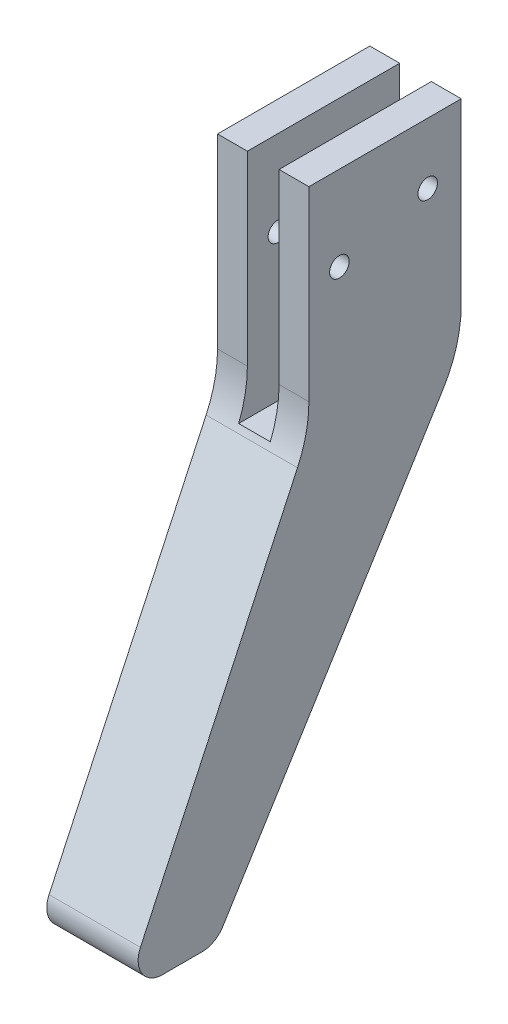
ISO-10303-21;
HEADER;
FILE_DESCRIPTION(('STEP AP214'),'2;1');
FILE_NAME('part.step','',(''),(''),'','','');
FILE_SCHEMA(('AUTOMOTIVE_DESIGN { 1 0 10303 214 1 1 1 1 }'));
ENDSEC;
DATA;
#1=APPLICATION_CONTEXT('core data for automotive mechanical design processes');
#2=APPLICATION_PROTOCOL_DEFINITION('international standard','automotive_design',2000,#1);
#3=PRODUCT_CONTEXT('',#1,'mechanical');
#4=PRODUCT('Part','Part','',(#3));
#5=PRODUCT_RELATED_PRODUCT_CATEGORY('part','',(#4));
#6=PRODUCT_DEFINITION_FORMATION('','',#4);
#7=PRODUCT_DEFINITION_CONTEXT('part definition',#1,'design');
#8=PRODUCT_DEFINITION('design','',#6,#7);
#9=PRODUCT_DEFINITION_SHAPE('','',#8);
#10=(LENGTH_UNIT() NAMED_UNIT(*) SI_UNIT(.MILLI.,.METRE.));
#11=(NAMED_UNIT(*) PLANE_ANGLE_UNIT() SI_UNIT($,.RADIAN.));
#12=(NAMED_UNIT(*) SI_UNIT($,.STERADIAN.) SOLID_ANGLE_UNIT());
#13=UNCERTAINTY_MEASURE_WITH_UNIT(LENGTH_MEASURE(1.E-05),#10,'distance_accuracy_value','');
#14=(GEOMETRIC_REPRESENTATION_CONTEXT(3) GLOBAL_UNCERTAINTY_ASSIGNED_CONTEXT((#13)) GLOBAL_UNIT_ASSIGNED_CONTEXT((#10,
#11,#12)) REPRESENTATION_CONTEXT('',''));
#15=CARTESIAN_POINT('',(0.,0.,0.));
#16=DIRECTION('',(0.,0.,1.));
#17=DIRECTION('',(1.,0.,0.));
#18=AXIS2_PLACEMENT_3D('',#15,#16,#17);
#19=CARTESIAN_POINT('',(7.5,-13.4117647058824,9.80392156862744));
#20=DIRECTION('',(0.,0.,-1.));
#21=DIRECTION('',(0.,1.,0.));
#22=AXIS2_PLACEMENT_3D('',#19,#20,#21);
#23=PLANE('',#22);
#24=DIRECTION('',(-1.,0.,0.));
#25=VECTOR('',#24,1.);
#26=CARTESIAN_POINT('',(7.5,-8.97787145302357,9.80392156862744));
#27=LINE('',#26,#25);
#28=CARTESIAN_POINT('',(-7.5,-8.97787145302357,9.80392156862744));
#29=VERTEX_POINT('',#28);
#30=CARTESIAN_POINT('',(-2.6,-8.97787145302357,9.80392156862744));
#31=VERTEX_POINT('',#30);
#32=EDGE_CURVE('E232',#29,#31,#27,.F.);
#33=ORIENTED_EDGE('',*,*,#32,.T.);
#34=DIRECTION('',(0.,1.,0.));
#35=VECTOR('',#34,1.);
#36=CARTESIAN_POINT('',(-2.6,-13.4117647058824,9.80392156862744));
#37=LINE('',#36,#35);
#38=CARTESIAN_POINT('',(-2.6,21.5882352941176,9.80392156862744));
#39=VERTEX_POINT('',#38);
#40=EDGE_CURVE('E170',#31,#39,#37,.T.);
#41=ORIENTED_EDGE('',*,*,#40,.T.);
#42=DIRECTION('',(-1.,0.,0.));
#43=VECTOR('',#42,1.);
#44=CARTESIAN_POINT('',(7.5,21.5882352941176,9.80392156862744));
#45=LINE('',#44,#43);
#46=CARTESIAN_POINT('',(-7.5,21.5882352941176,9.80392156862744));
#47=VERTEX_POINT('',#46);
#48=EDGE_CURVE('E194',#39,#47,#45,.T.);
#49=ORIENTED_EDGE('',*,*,#48,.T.);
#50=DIRECTION('',(0.,-1.,0.));
#51=VECTOR('',#50,1.);
#52=CARTESIAN_POINT('',(-7.5,-13.4117647058824,9.80392156862744));
#53=LINE('',#52,#51);
#54=EDGE_CURVE('E172',#47,#29,#53,.T.);
#55=ORIENTED_EDGE('',*,*,#54,.T.);
#56=EDGE_LOOP('',(#33,#41,#49,#55));
#57=FACE_BOUND('',#56,.T.);
#58=ADVANCED_FACE('F34',(#57),#23,.F.);
#59=CARTESIAN_POINT('',(7.5,21.5882352941176,-15.1960784313726));
#60=DIRECTION('',(0.,0.,1.));
#61=DIRECTION('',(0.,-1.,0.));
#62=AXIS2_PLACEMENT_3D('',#59,#60,#61);
#63=PLANE('',#62);
#64=DIRECTION('',(-1.,0.,0.));
#65=VECTOR('',#64,1.);
#66=CARTESIAN_POINT('',(7.5,21.5882352941176,-15.1960784313726));
#67=LINE('',#66,#65);
#68=CARTESIAN_POINT('',(-2.6,21.5882352941176,-15.1960784313726));
#69=VERTEX_POINT('',#68);
#70=CARTESIAN_POINT('',(-7.5,21.5882352941176,-15.1960784313726));
#71=VERTEX_POINT('',#70);
#72=EDGE_CURVE('E213',#69,#71,#67,.T.);
#73=ORIENTED_EDGE('',*,*,#72,.F.);
#74=DIRECTION('',(0.,-1.,0.));
#75=VECTOR('',#74,1.);
#76=CARTESIAN_POINT('',(-2.6,21.5882352941176,-15.1960784313726));
#77=LINE('',#76,#75);
#78=CARTESIAN_POINT('',(-2.6,-7.71361886225819,-15.1960784313726));
#79=VERTEX_POINT('',#78);
#80=EDGE_CURVE('E169',#69,#79,#77,.T.);
#81=ORIENTED_EDGE('',*,*,#80,.T.);
#82=DIRECTION('',(-1.,0.,0.));
#83=VECTOR('',#82,1.);
#84=CARTESIAN_POINT('',(7.5,-7.71361886225819,-15.1960784313726));
#85=LINE('',#84,#83);
#86=CARTESIAN_POINT('',(-7.5,-7.71361886225819,-15.1960784313726));
#87=VERTEX_POINT('',#86);
#88=EDGE_CURVE('E168',#79,#87,#85,.T.);
#89=ORIENTED_EDGE('',*,*,#88,.T.);
#90=DIRECTION('',(0.,1.,0.));
#91=VECTOR('',#90,1.);
#92=CARTESIAN_POINT('',(-7.5,21.5882352941176,-15.1960784313726));
#93=LINE('',#92,#91);
#94=EDGE_CURVE('E205',#87,#71,#93,.T.);
#95=ORIENTED_EDGE('',*,*,#94,.T.);
#96=EDGE_LOOP('',(#73,#81,#89,#95));
#97=FACE_BOUND('',#96,.T.);
#98=ADVANCED_FACE('F326',(#97),#63,.F.);
#99=CARTESIAN_POINT('',(7.5,21.5882352941176,9.80392156862744));
#100=DIRECTION('',(0.,-1.,0.));
#101=DIRECTION('',(0.,0.,-1.));
#102=AXIS2_PLACEMENT_3D('',#99,#100,#101);
#103=PLANE('',#102);
#104=ORIENTED_EDGE('',*,*,#48,.F.);
#105=DIRECTION('',(0.,0.,1.));
#106=VECTOR('',#105,1.);
#107=CARTESIAN_POINT('',(-2.6,21.5882352941176,-19.2260274795571));
#108=LINE('',#107,#106);
#109=EDGE_CURVE('E283',#69,#39,#108,.T.);
#110=ORIENTED_EDGE('',*,*,#109,.F.);
#111=ORIENTED_EDGE('',*,*,#72,.T.);
#112=DIRECTION('',(0.,0.,1.));
#113=VECTOR('',#112,1.);
#114=CARTESIAN_POINT('',(-7.5,21.5882352941176,9.80392156862744));
#115=LINE('',#114,#113);
#116=EDGE_CURVE('E183',#71,#47,#115,.T.);
#117=ORIENTED_EDGE('',*,*,#116,.T.);
#118=EDGE_LOOP('',(#104,#110,#111,#117));
#119=FACE_BOUND('',#118,.T.);
#120=ADVANCED_FACE('F317',(#119),#103,.F.);
#121=CARTESIAN_POINT('',(7.5,21.5882352941176,9.80392156862744));
#122=VERTEX_POINT('',#121);
#123=CARTESIAN_POINT('',(2.6,21.5882352941176,9.80392156862744));
#124=VERTEX_POINT('',#123);
#125=EDGE_CURVE('E210',#122,#124,#45,.T.);
#126=ORIENTED_EDGE('',*,*,#125,.T.);
#127=DIRECTION('',(0.,-1.,0.));
#128=VECTOR('',#127,1.);
#129=CARTESIAN_POINT('',(2.6,-13.4117647058824,9.80392156862744));
#130=LINE('',#129,#128);
#131=CARTESIAN_POINT('',(2.6,-8.97787145302357,9.80392156862744));
#132=VERTEX_POINT('',#131);
#133=EDGE_CURVE('E156',#124,#132,#130,.T.);
#134=ORIENTED_EDGE('',*,*,#133,.T.);
#135=CARTESIAN_POINT('',(7.5,-8.97787145302357,9.80392156862744));
#136=VERTEX_POINT('',#135);
#137=EDGE_CURVE('E231',#132,#136,#27,.F.);
#138=ORIENTED_EDGE('',*,*,#137,.T.);
#139=DIRECTION('',(0.,-1.,0.));
#140=VECTOR('',#139,1.);
#141=CARTESIAN_POINT('',(7.5,-13.4117647058824,9.80392156862744));
#142=LINE('',#141,#140);
#143=EDGE_CURVE('E179',#122,#136,#142,.T.);
#144=ORIENTED_EDGE('',*,*,#143,.F.);
#145=EDGE_LOOP('',(#126,#134,#138,#144));
#146=FACE_BOUND('',#145,.T.);
#147=ADVANCED_FACE('F314',(#146),#23,.F.);
#148=CARTESIAN_POINT('',(7.5,-78.4117647058824,40.1139193487024));
#149=DIRECTION('',(0.,-0.4226182617407,-0.90630778703665));
#150=DIRECTION('',(0.,0.90630778703665,-0.4226182617407));
#151=AXIS2_PLACEMENT_3D('',#148,#149,#150);
#152=PLANE('',#151);
#153=DIRECTION('',(0.,-0.90630778703665,0.4226182617407));
#154=VECTOR('',#153,1.);
#155=CARTESIAN_POINT('',(-7.5,-78.4117647058824,40.1139193487024));
#156=LINE('',#155,#154);
#157=CARTESIAN_POINT('',(-7.5,-17.4302366878376,11.6777658278944));
#158=VERTEX_POINT('',#157);
#159=CARTESIAN_POINT('',(-7.5,-72.7212916589196,37.460408188379));
#160=VERTEX_POINT('',#159);
#161=EDGE_CURVE('E197',#158,#160,#156,.T.);
#162=ORIENTED_EDGE('',*,*,#161,.T.);
#163=DIRECTION('',(-1.,0.,0.));
#164=VECTOR('',#163,1.);
#165=CARTESIAN_POINT('',(7.5,-72.7212916589196,37.460408188379));
#166=LINE('',#165,#164);
#167=CARTESIAN_POINT('',(7.5,-72.7212916589196,37.460408188379));
#168=VERTEX_POINT('',#167);
#169=EDGE_CURVE('E248',#160,#168,#166,.F.);
#170=ORIENTED_EDGE('',*,*,#169,.T.);
#171=DIRECTION('',(0.,-0.90630778703665,0.4226182617407));
#172=VECTOR('',#171,1.);
#173=CARTESIAN_POINT('',(7.5,-78.4117647058824,40.1139193487024));
#174=LINE('',#173,#172);
#175=CARTESIAN_POINT('',(7.5,-17.4302366878376,11.6777658278944));
#176=VERTEX_POINT('',#175);
#177=EDGE_CURVE('E182',#176,#168,#174,.T.);
#178=ORIENTED_EDGE('',*,*,#177,.F.);
#179=DIRECTION('',(-1.,0.,0.));
#180=VECTOR('',#179,1.);
#181=CARTESIAN_POINT('',(-7.5,-17.4302366878376,11.6777658278944));
#182=LINE('',#181,#180);
#183=EDGE_CURVE('E228',#176,#158,#182,.T.);
#184=ORIENTED_EDGE('',*,*,#183,.T.);
#185=EDGE_LOOP('',(#162,#170,#178,#184));
#186=FACE_BOUND('',#185,.T.);
#187=ADVANCED_FACE('F316',(#186),#152,.F.);
#188=CARTESIAN_POINT('',(7.5,-78.4117647058824,25.1139193487024));
#189=DIRECTION('',(0.,1.,0.));
#190=DIRECTION('',(0.,0.,1.));
#191=AXIS2_PLACEMENT_3D('',#188,#189,#190);
#192=PLANE('',#191);
#193=DIRECTION('',(0.,0.,-1.));
#194=VECTOR('',#193,1.);
#195=CARTESIAN_POINT('',(7.5,-78.4117647058824,25.1139193487024));
#196=LINE('',#195,#194);
#197=CARTESIAN_POINT('',(7.5,-78.4117647058824,33.8351770402324));
#198=VERTEX_POINT('',#197);
#199=CARTESIAN_POINT('',(7.5,-78.4117647058824,27.3400494739502));
#200=VERTEX_POINT('',#199);
#201=EDGE_CURVE('E186',#198,#200,#196,.T.);
#202=ORIENTED_EDGE('',*,*,#201,.F.);
#203=DIRECTION('',(-1.,0.,0.));
#204=VECTOR('',#203,1.);
#205=CARTESIAN_POINT('',(7.5,-78.4117647058824,33.8351770402324));
#206=LINE('',#205,#204);
#207=CARTESIAN_POINT('',(-7.5,-78.4117647058824,33.8351770402324));
#208=VERTEX_POINT('',#207);
#209=EDGE_CURVE('E241',#198,#208,#206,.T.);
#210=ORIENTED_EDGE('',*,*,#209,.T.);
#211=DIRECTION('',(0.,0.,-1.));
#212=VECTOR('',#211,1.);
#213=CARTESIAN_POINT('',(-7.5,-78.4117647058824,25.1139193487024));
#214=LINE('',#213,#212);
#215=CARTESIAN_POINT('',(-7.5,-78.4117647058824,27.3400494739502));
#216=VERTEX_POINT('',#215);
#217=EDGE_CURVE('E200',#208,#216,#214,.T.);
#218=ORIENTED_EDGE('',*,*,#217,.T.);
#219=DIRECTION('',(-1.,0.,0.));
#220=VECTOR('',#219,1.);
#221=CARTESIAN_POINT('',(7.5,-78.4117647058824,27.3400494739502));
#222=LINE('',#221,#220);
#223=EDGE_CURVE('E239',#216,#200,#222,.F.);
#224=ORIENTED_EDGE('',*,*,#223,.T.);
#225=EDGE_LOOP('',(#202,#210,#218,#224));
#226=FACE_BOUND('',#225,.T.);
#227=ADVANCED_FACE('F323',(#226),#192,.F.);
#228=CARTESIAN_POINT('',(7.5,-13.4117647058824,-15.1960784313726));
#229=DIRECTION('',(0.,0.527034086462698,0.849844145538716));
#230=DIRECTION('',(0.,-0.849844145538716,0.527034086462698));
#231=AXIS2_PLACEMENT_3D('',#228,#229,#230);
#232=PLANE('',#231);
#233=DIRECTION('',(0.,0.849844145538716,-0.527034086462698));
#234=VECTOR('',#233,1.);
#235=CARTESIAN_POINT('',(7.5,-13.4117647058824,-15.1960784313726));
#236=LINE('',#235,#234);
#237=CARTESIAN_POINT('',(7.5,-76.5199010517331,23.9406728917953));
#238=VERTEX_POINT('',#237);
#239=CARTESIAN_POINT('',(7.5,-18.2543005915122,-12.1929613421469));
#240=VERTEX_POINT('',#239);
#241=EDGE_CURVE('E188',#238,#240,#236,.T.);
#242=ORIENTED_EDGE('',*,*,#241,.F.);
#243=DIRECTION('',(-1.,0.,0.));
#244=VECTOR('',#243,1.);
#245=CARTESIAN_POINT('',(7.5,-76.5199010517331,23.9406728917953));
#246=LINE('',#245,#244);
#247=CARTESIAN_POINT('',(-7.5,-76.5199010517331,23.9406728917953));
#248=VERTEX_POINT('',#247);
#249=EDGE_CURVE('E253',#238,#248,#246,.T.);
#250=ORIENTED_EDGE('',*,*,#249,.T.);
#251=DIRECTION('',(0.,0.849844145538716,-0.527034086462698));
#252=VECTOR('',#251,1.);
#253=CARTESIAN_POINT('',(-7.5,-13.4117647058824,-15.1960784313726));
#254=LINE('',#253,#252);
#255=CARTESIAN_POINT('',(-7.5,-18.2543005915122,-12.1929613421469));
#256=VERTEX_POINT('',#255);
#257=EDGE_CURVE('E203',#248,#256,#254,.T.);
#258=ORIENTED_EDGE('',*,*,#257,.T.);
#259=DIRECTION('',(-1.,0.,0.));
#260=VECTOR('',#259,1.);
#261=CARTESIAN_POINT('',(7.5,-18.2543005915122,-12.1929613421469));
#262=LINE('',#261,#260);
#263=EDGE_CURVE('E223',#256,#240,#262,.F.);
#264=ORIENTED_EDGE('',*,*,#263,.T.);
#265=EDGE_LOOP('',(#242,#250,#258,#264));
#266=FACE_BOUND('',#265,.T.);
#267=ADVANCED_FACE('F357',(#266),#232,.F.);
#268=CARTESIAN_POINT('',(7.5,-7.71361886225819,-15.1960784313726));
#269=VERTEX_POINT('',#268);
#270=CARTESIAN_POINT('',(2.6,-7.7136188622582,-15.1960784313726));
#271=VERTEX_POINT('',#270);
#272=EDGE_CURVE('E217',#269,#271,#85,.T.);
#273=ORIENTED_EDGE('',*,*,#272,.T.);
#274=DIRECTION('',(0.,1.,0.));
#275=VECTOR('',#274,1.);
#276=CARTESIAN_POINT('',(2.6,21.5882352941176,-15.1960784313726));
#277=LINE('',#276,#275);
#278=CARTESIAN_POINT('',(2.6,21.5882352941176,-15.1960784313726));
#279=VERTEX_POINT('',#278);
#280=EDGE_CURVE('E175',#271,#279,#277,.T.);
#281=ORIENTED_EDGE('',*,*,#280,.T.);
#282=CARTESIAN_POINT('',(7.5,21.5882352941176,-15.1960784313726));
#283=VERTEX_POINT('',#282);
#284=EDGE_CURVE('E214',#283,#279,#67,.T.);
#285=ORIENTED_EDGE('',*,*,#284,.F.);
#286=DIRECTION('',(0.,1.,0.));
#287=VECTOR('',#286,1.);
#288=CARTESIAN_POINT('',(7.5,21.5882352941176,-15.1960784313726));
#289=LINE('',#288,#287);
#290=EDGE_CURVE('E190',#269,#283,#289,.T.);
#291=ORIENTED_EDGE('',*,*,#290,.F.);
#292=EDGE_LOOP('',(#273,#281,#285,#291));
#293=FACE_BOUND('',#292,.T.);
#294=ADVANCED_FACE('F294',(#293),#63,.F.);
#295=ORIENTED_EDGE('',*,*,#284,.T.);
#296=DIRECTION('',(0.,0.,-1.));
#297=VECTOR('',#296,1.);
#298=CARTESIAN_POINT('',(2.6,21.5882352941176,-19.2260274795571));
#299=LINE('',#298,#297);
#300=EDGE_CURVE('E163',#124,#279,#299,.T.);
#301=ORIENTED_EDGE('',*,*,#300,.F.);
#302=ORIENTED_EDGE('',*,*,#125,.F.);
#303=DIRECTION('',(0.,0.,1.));
#304=VECTOR('',#303,1.);
#305=CARTESIAN_POINT('',(7.5,21.5882352941176,9.80392156862744));
#306=LINE('',#305,#304);
#307=EDGE_CURVE('E192',#283,#122,#306,.T.);
#308=ORIENTED_EDGE('',*,*,#307,.F.);
#309=EDGE_LOOP('',(#295,#301,#302,#308));
#310=FACE_BOUND('',#309,.T.);
#311=ADVANCED_FACE('F301',(#310),#103,.F.);
#312=CARTESIAN_POINT('',(7.5,0.,0.));
#313=DIRECTION('',(-1.,0.,0.));
#314=DIRECTION('',(0.,0.,1.));
#315=AXIS2_PLACEMENT_3D('',#312,#313,#314);
#316=PLANE('',#315);
#317=CARTESIAN_POINT('',(7.5,11.5882352941176,-9.69607843137256));
#318=DIRECTION('',(-1.,0.,0.));
#319=DIRECTION('',(0.,0.,1.));
#320=AXIS2_PLACEMENT_3D('',#317,#318,#319);
#321=CIRCLE('',#320,1.6);
#322=CARTESIAN_POINT('',(7.5,11.5882352941176,-8.09607843137256));
#323=VERTEX_POINT('',#322);
#324=EDGE_CURVE('E262',#323,#323,#321,.F.);
#325=ORIENTED_EDGE('',*,*,#324,.F.);
#326=EDGE_LOOP('',(#325));
#327=FACE_BOUND('',#326,.T.);
#328=CARTESIAN_POINT('',(7.5,7.70297200386635,4.80392156862744));
#329=DIRECTION('',(-1.,0.,0.));
#330=DIRECTION('',(0.,0.,1.));
#331=AXIS2_PLACEMENT_3D('',#328,#329,#330);
#332=CIRCLE('',#331,1.6);
#333=CARTESIAN_POINT('',(7.5,7.70297200386635,6.40392156862744));
#334=VERTEX_POINT('',#333);
#335=EDGE_CURVE('E273',#334,#334,#332,.F.);
#336=ORIENTED_EDGE('',*,*,#335,.F.);
#337=EDGE_LOOP('',(#336));
#338=FACE_BOUND('',#337,.T.);
#339=ORIENTED_EDGE('',*,*,#177,.T.);
#340=CARTESIAN_POINT('',(7.5,-74.4117647058824,33.8351770402324));
#341=DIRECTION('',(-1.,0.,0.));
#342=DIRECTION('',(0.,0.,1.));
#343=AXIS2_PLACEMENT_3D('',#340,#341,#342);
#344=CIRCLE('',#343,4.);
#345=EDGE_CURVE('E251',#168,#198,#344,.F.);
#346=ORIENTED_EDGE('',*,*,#345,.T.);
#347=ORIENTED_EDGE('',*,*,#201,.T.);
#348=CARTESIAN_POINT('',(7.5,-74.4117647058824,27.3400494739502));
#349=DIRECTION('',(-1.,0.,0.));
#350=DIRECTION('',(0.,0.,1.));
#351=AXIS2_PLACEMENT_3D('',#348,#349,#350);
#352=CIRCLE('',#351,4.);
#353=EDGE_CURVE('E59',#200,#238,#352,.F.);
#354=ORIENTED_EDGE('',*,*,#353,.T.);
#355=ORIENTED_EDGE('',*,*,#241,.T.);
#356=CARTESIAN_POINT('',(7.5,-7.7136188622582,4.80392156862743));
#357=DIRECTION('',(-1.,0.,0.));
#358=DIRECTION('',(0.,0.,1.));
#359=AXIS2_PLACEMENT_3D('',#356,#357,#358);
#360=CIRCLE('',#359,20.);
#361=EDGE_CURVE('E226',#240,#269,#360,.F.);
#362=ORIENTED_EDGE('',*,*,#361,.T.);
#363=ORIENTED_EDGE('',*,*,#290,.T.);
#364=ORIENTED_EDGE('',*,*,#307,.T.);
#365=ORIENTED_EDGE('',*,*,#143,.T.);
#366=CARTESIAN_POINT('',(7.5,-8.97787145302357,29.8039215686274));
#367=DIRECTION('',(-1.,0.,0.));
#368=DIRECTION('',(0.,0.,1.));
#369=AXIS2_PLACEMENT_3D('',#366,#367,#368);
#370=CIRCLE('',#369,20.);
#371=EDGE_CURVE('E237',#136,#176,#370,.T.);
#372=ORIENTED_EDGE('',*,*,#371,.T.);
#373=EDGE_LOOP('',(#339,#346,#347,#354,#355,#362,#363,#364,#365,#372));
#374=FACE_BOUND('',#373,.T.);
#375=ADVANCED_FACE('F304',(#327,#338,#374),#316,.F.);
#376=CARTESIAN_POINT('',(-7.5,0.,0.));
#377=DIRECTION('',(-1.,0.,0.));
#378=DIRECTION('',(0.,0.,1.));
#379=AXIS2_PLACEMENT_3D('',#376,#377,#378);
#380=PLANE('',#379);
#381=CARTESIAN_POINT('',(-7.5,11.5882352941176,-9.69607843137256));
#382=DIRECTION('',(-1.,0.,0.));
#383=DIRECTION('',(0.,0.,1.));
#384=AXIS2_PLACEMENT_3D('',#381,#382,#383);
#385=CIRCLE('',#384,1.6);
#386=CARTESIAN_POINT('',(-7.5,11.5882352941176,-8.09607843137256));
#387=VERTEX_POINT('',#386);
#388=EDGE_CURVE('E268',#387,#387,#385,.T.);
#389=ORIENTED_EDGE('',*,*,#388,.F.);
#390=EDGE_LOOP('',(#389));
#391=FACE_BOUND('',#390,.T.);
#392=CARTESIAN_POINT('',(-7.5,7.70297200386635,4.80392156862744));
#393=DIRECTION('',(-1.,0.,0.));
#394=DIRECTION('',(0.,0.,1.));
#395=AXIS2_PLACEMENT_3D('',#392,#393,#394);
#396=CIRCLE('',#395,1.6);
#397=CARTESIAN_POINT('',(-7.5,7.70297200386635,6.40392156862744));
#398=VERTEX_POINT('',#397);
#399=EDGE_CURVE('E276',#398,#398,#396,.T.);
#400=ORIENTED_EDGE('',*,*,#399,.F.);
#401=EDGE_LOOP('',(#400));
#402=FACE_BOUND('',#401,.T.);
#403=ORIENTED_EDGE('',*,*,#217,.F.);
#404=CARTESIAN_POINT('',(-7.5,-74.4117647058824,33.8351770402324));
#405=DIRECTION('',(-1.,0.,0.));
#406=DIRECTION('',(0.,0.,1.));
#407=AXIS2_PLACEMENT_3D('',#404,#405,#406);
#408=CIRCLE('',#407,4.);
#409=EDGE_CURVE('E246',#208,#160,#408,.T.);
#410=ORIENTED_EDGE('',*,*,#409,.T.);
#411=ORIENTED_EDGE('',*,*,#161,.F.);
#412=CARTESIAN_POINT('',(-7.5,-8.97787145302357,29.8039215686274));
#413=DIRECTION('',(-1.,0.,0.));
#414=DIRECTION('',(0.,0.,1.));
#415=AXIS2_PLACEMENT_3D('',#412,#413,#414);
#416=CIRCLE('',#415,20.);
#417=EDGE_CURVE('E235',#158,#29,#416,.F.);
#418=ORIENTED_EDGE('',*,*,#417,.T.);
#419=ORIENTED_EDGE('',*,*,#54,.F.);
#420=ORIENTED_EDGE('',*,*,#116,.F.);
#421=ORIENTED_EDGE('',*,*,#94,.F.);
#422=CARTESIAN_POINT('',(-7.5,-7.7136188622582,4.80392156862743));
#423=DIRECTION('',(-1.,0.,0.));
#424=DIRECTION('',(0.,0.,1.));
#425=AXIS2_PLACEMENT_3D('',#422,#423,#424);
#426=CIRCLE('',#425,20.);
#427=EDGE_CURVE('E220',#87,#256,#426,.T.);
#428=ORIENTED_EDGE('',*,*,#427,.T.);
#429=ORIENTED_EDGE('',*,*,#257,.F.);
#430=CARTESIAN_POINT('',(-7.5,-74.4117647058824,27.3400494739502));
#431=DIRECTION('',(-1.,0.,0.));
#432=DIRECTION('',(0.,0.,1.));
#433=AXIS2_PLACEMENT_3D('',#430,#431,#432);
#434=CIRCLE('',#433,4.);
#435=EDGE_CURVE('E244',#248,#216,#434,.T.);
#436=ORIENTED_EDGE('',*,*,#435,.T.);
#437=EDGE_LOOP('',(#403,#410,#411,#418,#419,#420,#421,#428,#429,#436));
#438=FACE_BOUND('',#437,.T.);
#439=ADVANCED_FACE('F345',(#391,#402,#438),#380,.T.);
#440=CARTESIAN_POINT('',(7.5,-7.7136188622582,4.80392156862743));
#441=DIRECTION('',(-1.,0.,0.));
#442=DIRECTION('',(0.,0.,1.));
#443=AXIS2_PLACEMENT_3D('',#440,#441,#442);
#444=CYLINDRICAL_SURFACE('',#443,20.);
#445=CARTESIAN_POINT('',(-2.6,-7.7136188622582,4.80392156862743));
#446=DIRECTION('',(-1.,0.,0.));
#447=DIRECTION('',(0.,0.,1.));
#448=AXIS2_PLACEMENT_3D('',#445,#446,#447);
#449=CIRCLE('',#448,20.);
#450=CARTESIAN_POINT('',(-2.6,-16.4117647058824,-13.2055831131522));
#451=VERTEX_POINT('',#450);
#452=EDGE_CURVE('E160',#451,#79,#449,.F.);
#453=ORIENTED_EDGE('',*,*,#452,.F.);
#454=DIRECTION('',(-1.,0.,0.));
#455=VECTOR('',#454,1.);
#456=CARTESIAN_POINT('',(7.5,-16.4117647058824,-13.2055831131522));
#457=LINE('',#456,#455);
#458=CARTESIAN_POINT('',(2.6,-16.4117647058824,-13.2055831131522));
#459=VERTEX_POINT('',#458);
#460=EDGE_CURVE('E149',#451,#459,#457,.F.);
#461=ORIENTED_EDGE('',*,*,#460,.T.);
#462=CARTESIAN_POINT('',(2.6,-7.7136188622582,4.80392156862743));
#463=DIRECTION('',(1.,0.,0.));
#464=DIRECTION('',(0.,0.,-1.));
#465=AXIS2_PLACEMENT_3D('',#462,#463,#464);
#466=CIRCLE('',#465,20.);
#467=EDGE_CURVE('E290',#271,#459,#466,.F.);
#468=ORIENTED_EDGE('',*,*,#467,.F.);
#469=ORIENTED_EDGE('',*,*,#272,.F.);
#470=ORIENTED_EDGE('',*,*,#361,.F.);
#471=ORIENTED_EDGE('',*,*,#263,.F.);
#472=ORIENTED_EDGE('',*,*,#427,.F.);
#473=ORIENTED_EDGE('',*,*,#88,.F.);
#474=EDGE_LOOP('',(#453,#461,#468,#469,#470,#471,#472,#473));
#475=FACE_BOUND('',#474,.T.);
#476=ADVANCED_FACE('F166',(#475),#444,.T.);
#477=CARTESIAN_POINT('',(7.5,-8.97787145302357,29.8039215686274));
#478=DIRECTION('',(1.,0.,0.));
#479=DIRECTION('',(0.,0.,-1.));
#480=AXIS2_PLACEMENT_3D('',#477,#478,#479);
#481=CYLINDRICAL_SURFACE('',#480,20.);
#482=DIRECTION('',(1.,0.,0.));
#483=VECTOR('',#482,1.);
#484=CARTESIAN_POINT('',(7.5,-16.4117647058824,11.2368207958869));
#485=LINE('',#484,#483);
#486=CARTESIAN_POINT('',(-2.6,-16.4117647058824,11.2368207958869));
#487=VERTEX_POINT('',#486);
#488=CARTESIAN_POINT('',(2.6,-16.4117647058824,11.2368207958869));
#489=VERTEX_POINT('',#488);
#490=EDGE_CURVE('E256',#487,#489,#485,.T.);
#491=ORIENTED_EDGE('',*,*,#490,.F.);
#492=CARTESIAN_POINT('',(-2.59999999999999,-8.97787145302357,29.8039215686274));
#493=DIRECTION('',(-1.,0.,0.));
#494=DIRECTION('',(0.,0.,1.));
#495=AXIS2_PLACEMENT_3D('',#492,#493,#494);
#496=CIRCLE('',#495,20.);
#497=EDGE_CURVE('E11',#487,#31,#496,.F.);
#498=ORIENTED_EDGE('',*,*,#497,.T.);
#499=ORIENTED_EDGE('',*,*,#32,.F.);
#500=ORIENTED_EDGE('',*,*,#417,.F.);
#501=ORIENTED_EDGE('',*,*,#183,.F.);
#502=ORIENTED_EDGE('',*,*,#371,.F.);
#503=ORIENTED_EDGE('',*,*,#137,.F.);
#504=CARTESIAN_POINT('',(2.60000000000001,-8.97787145302357,29.8039215686274));
#505=DIRECTION('',(1.,0.,0.));
#506=DIRECTION('',(0.,0.,-1.));
#507=AXIS2_PLACEMENT_3D('',#504,#505,#506);
#508=CIRCLE('',#507,20.);
#509=EDGE_CURVE('E43',#132,#489,#508,.F.);
#510=ORIENTED_EDGE('',*,*,#509,.T.);
#511=EDGE_LOOP('',(#491,#498,#499,#500,#501,#502,#503,#510));
#512=FACE_BOUND('',#511,.T.);
#513=ADVANCED_FACE('F311',(#512),#481,.F.);
#514=CARTESIAN_POINT('',(7.5,-74.4117647058824,33.8351770402324));
#515=DIRECTION('',(-1.,0.,0.));
#516=DIRECTION('',(0.,0.,1.));
#517=AXIS2_PLACEMENT_3D('',#514,#515,#516);
#518=CYLINDRICAL_SURFACE('',#517,4.);
#519=ORIENTED_EDGE('',*,*,#345,.F.);
#520=ORIENTED_EDGE('',*,*,#169,.F.);
#521=ORIENTED_EDGE('',*,*,#409,.F.);
#522=ORIENTED_EDGE('',*,*,#209,.F.);
#523=EDGE_LOOP('',(#519,#520,#521,#522));
#524=FACE_BOUND('',#523,.T.);
#525=ADVANCED_FACE('F349',(#524),#518,.T.);
#526=CARTESIAN_POINT('',(7.5,-74.4117647058824,27.3400494739502));
#527=DIRECTION('',(-1.,0.,0.));
#528=DIRECTION('',(0.,0.,1.));
#529=AXIS2_PLACEMENT_3D('',#526,#527,#528);
#530=CYLINDRICAL_SURFACE('',#529,4.);
#531=ORIENTED_EDGE('',*,*,#353,.F.);
#532=ORIENTED_EDGE('',*,*,#223,.F.);
#533=ORIENTED_EDGE('',*,*,#435,.F.);
#534=ORIENTED_EDGE('',*,*,#249,.F.);
#535=EDGE_LOOP('',(#531,#532,#533,#534));
#536=FACE_BOUND('',#535,.T.);
#537=ADVANCED_FACE('F36',(#536),#530,.T.);
#538=CARTESIAN_POINT('',(-2.6,-16.4117647058824,-19.2260274795571));
#539=DIRECTION('',(-1.,0.,0.));
#540=DIRECTION('',(0.,0.,1.));
#541=AXIS2_PLACEMENT_3D('',#538,#539,#540);
#542=PLANE('',#541);
#543=CARTESIAN_POINT('',(-2.6,11.5882352941176,-9.69607843137256));
#544=DIRECTION('',(-1.,0.,0.));
#545=DIRECTION('',(0.,0.,1.));
#546=AXIS2_PLACEMENT_3D('',#543,#544,#545);
#547=CIRCLE('',#546,1.6);
#548=CARTESIAN_POINT('',(-2.6,11.5882352941176,-8.09607843137256));
#549=VERTEX_POINT('',#548);
#550=EDGE_CURVE('E281',#549,#549,#547,.T.);
#551=ORIENTED_EDGE('',*,*,#550,.T.);
#552=EDGE_LOOP('',(#551));
#553=FACE_BOUND('',#552,.T.);
#554=CARTESIAN_POINT('',(-2.6,7.70297200386635,4.80392156862744));
#555=DIRECTION('',(-1.,0.,0.));
#556=DIRECTION('',(0.,0.,1.));
#557=AXIS2_PLACEMENT_3D('',#554,#555,#556);
#558=CIRCLE('',#557,1.6);
#559=CARTESIAN_POINT('',(-2.6,7.70297200386635,6.40392156862744));
#560=VERTEX_POINT('',#559);
#561=EDGE_CURVE('E261',#560,#560,#558,.T.);
#562=ORIENTED_EDGE('',*,*,#561,.T.);
#563=EDGE_LOOP('',(#562));
#564=FACE_BOUND('',#563,.T.);
#565=ORIENTED_EDGE('',*,*,#109,.T.);
#566=ORIENTED_EDGE('',*,*,#40,.F.);
#567=ORIENTED_EDGE('',*,*,#497,.F.);
#568=DIRECTION('',(0.,0.,1.));
#569=VECTOR('',#568,1.);
#570=CARTESIAN_POINT('',(-2.6,-16.4117647058824,-19.2260274795571));
#571=LINE('',#570,#569);
#572=EDGE_CURVE('E51',#451,#487,#571,.T.);
#573=ORIENTED_EDGE('',*,*,#572,.F.);
#574=ORIENTED_EDGE('',*,*,#452,.T.);
#575=ORIENTED_EDGE('',*,*,#80,.F.);
#576=EDGE_LOOP('',(#565,#566,#567,#573,#574,#575));
#577=FACE_BOUND('',#576,.T.);
#578=ADVANCED_FACE('F159',(#553,#564,#577),#542,.F.);
#579=CARTESIAN_POINT('',(2.6,-16.4117647058824,-19.2260274795571));
#580=DIRECTION('',(1.,0.,0.));
#581=DIRECTION('',(0.,0.,-1.));
#582=AXIS2_PLACEMENT_3D('',#579,#580,#581);
#583=PLANE('',#582);
#584=CARTESIAN_POINT('',(2.6,11.5882352941176,-9.69607843137256));
#585=DIRECTION('',(1.,0.,0.));
#586=DIRECTION('',(0.,0.,-1.));
#587=AXIS2_PLACEMENT_3D('',#584,#585,#586);
#588=CIRCLE('',#587,1.6);
#589=CARTESIAN_POINT('',(2.6,11.5882352941176,-11.2960784313726));
#590=VERTEX_POINT('',#589);
#591=EDGE_CURVE('E38',#590,#590,#588,.T.);
#592=ORIENTED_EDGE('',*,*,#591,.T.);
#593=EDGE_LOOP('',(#592));
#594=FACE_BOUND('',#593,.T.);
#595=CARTESIAN_POINT('',(2.6,7.70297200386635,4.80392156862744));
#596=DIRECTION('',(1.,0.,0.));
#597=DIRECTION('',(0.,0.,-1.));
#598=AXIS2_PLACEMENT_3D('',#595,#596,#597);
#599=CIRCLE('',#598,1.6);
#600=CARTESIAN_POINT('',(2.6,7.70297200386635,3.20392156862744));
#601=VERTEX_POINT('',#600);
#602=EDGE_CURVE('E259',#601,#601,#599,.T.);
#603=ORIENTED_EDGE('',*,*,#602,.T.);
#604=EDGE_LOOP('',(#603));
#605=FACE_BOUND('',#604,.T.);
#606=ORIENTED_EDGE('',*,*,#467,.T.);
#607=DIRECTION('',(0.,0.,-1.));
#608=VECTOR('',#607,1.);
#609=CARTESIAN_POINT('',(2.6,-16.4117647058824,-19.2260274795571));
#610=LINE('',#609,#608);
#611=EDGE_CURVE('E152',#489,#459,#610,.T.);
#612=ORIENTED_EDGE('',*,*,#611,.F.);
#613=ORIENTED_EDGE('',*,*,#509,.F.);
#614=ORIENTED_EDGE('',*,*,#133,.F.);
#615=ORIENTED_EDGE('',*,*,#300,.T.);
#616=ORIENTED_EDGE('',*,*,#280,.F.);
#617=EDGE_LOOP('',(#606,#612,#613,#614,#615,#616));
#618=FACE_BOUND('',#617,.T.);
#619=ADVANCED_FACE('F308',(#594,#605,#618),#583,.F.);
#620=CARTESIAN_POINT('',(0.,-16.4117647058824,0.));
#621=DIRECTION('',(0.,1.,0.));
#622=DIRECTION('',(0.,0.,1.));
#623=AXIS2_PLACEMENT_3D('',#620,#621,#622);
#624=PLANE('',#623);
#625=ORIENTED_EDGE('',*,*,#572,.T.);
#626=ORIENTED_EDGE('',*,*,#490,.T.);
#627=ORIENTED_EDGE('',*,*,#611,.T.);
#628=ORIENTED_EDGE('',*,*,#460,.F.);
#629=EDGE_LOOP('',(#625,#626,#627,#628));
#630=FACE_BOUND('',#629,.T.);
#631=ADVANCED_FACE('F150',(#630),#624,.T.);
#632=CARTESIAN_POINT('',(12.0254833995939,7.70297200386635,4.80392156862744));
#633=DIRECTION('',(-1.,0.,0.));
#634=DIRECTION('',(0.,0.,1.));
#635=AXIS2_PLACEMENT_3D('',#632,#633,#634);
#636=CYLINDRICAL_SURFACE('',#635,1.6);
#637=ORIENTED_EDGE('',*,*,#335,.T.);
#638=EDGE_LOOP('',(#637));
#639=FACE_BOUND('',#638,.T.);
#640=ORIENTED_EDGE('',*,*,#602,.F.);
#641=EDGE_LOOP('',(#640));
#642=FACE_BOUND('',#641,.T.);
#643=ADVANCED_FACE('F385',(#639,#642),#636,.F.);
#644=CARTESIAN_POINT('',(12.0254833995939,11.5882352941176,-9.69607843137256));
#645=DIRECTION('',(-1.,0.,0.));
#646=DIRECTION('',(0.,0.,1.));
#647=AXIS2_PLACEMENT_3D('',#644,#645,#646);
#648=CYLINDRICAL_SURFACE('',#647,1.6);
#649=ORIENTED_EDGE('',*,*,#324,.T.);
#650=EDGE_LOOP('',(#649));
#651=FACE_BOUND('',#650,.T.);
#652=ORIENTED_EDGE('',*,*,#591,.F.);
#653=EDGE_LOOP('',(#652));
#654=FACE_BOUND('',#653,.T.);
#655=ADVANCED_FACE('F390',(#651,#654),#648,.F.);
#656=ORIENTED_EDGE('',*,*,#399,.T.);
#657=EDGE_LOOP('',(#656));
#658=FACE_BOUND('',#657,.T.);
#659=ORIENTED_EDGE('',*,*,#561,.F.);
#660=EDGE_LOOP('',(#659));
#661=FACE_BOUND('',#660,.T.);
#662=ADVANCED_FACE('F386',(#658,#661),#636,.F.);
#663=ORIENTED_EDGE('',*,*,#388,.T.);
#664=EDGE_LOOP('',(#663));
#665=FACE_BOUND('',#664,.T.);
#666=ORIENTED_EDGE('',*,*,#550,.F.);
#667=EDGE_LOOP('',(#666));
#668=FACE_BOUND('',#667,.T.);
#669=ADVANCED_FACE('F389',(#665,#668),#648,.F.);
#670=CLOSED_SHELL('',(#58,#98,#120,#147,#187,#227,#267,#294,#311,#375,#439,#476,#513,#525,#537,
#578,#619,#631,#643,#655,#662,#669));
#671=MANIFOLD_SOLID_BREP('B2',#670);
#672=ADVANCED_BREP_SHAPE_REPRESENTATION('',(#18,#671),#14);
#673=SHAPE_DEFINITION_REPRESENTATION(#9,#672);
ENDSEC;
END-ISO-10303-21;
